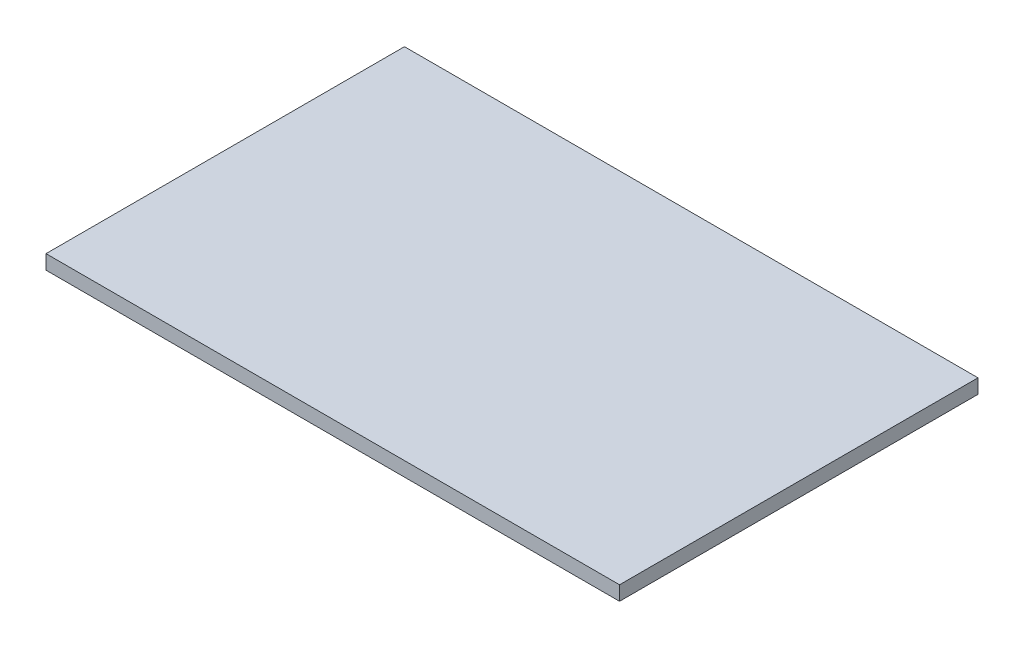
ISO-10303-21;
HEADER;
FILE_DESCRIPTION(('STEP AP214'),'2;1');
FILE_NAME('part.step','',(''),(''),'','','');
FILE_SCHEMA(('AUTOMOTIVE_DESIGN { 1 0 10303 214 1 1 1 1 }'));
ENDSEC;
DATA;
#1=APPLICATION_CONTEXT('core data for automotive mechanical design processes');
#2=APPLICATION_PROTOCOL_DEFINITION('international standard','automotive_design',2000,#1);
#3=PRODUCT_CONTEXT('',#1,'mechanical');
#4=PRODUCT('Part','Part','',(#3));
#5=PRODUCT_RELATED_PRODUCT_CATEGORY('part','',(#4));
#6=PRODUCT_DEFINITION_FORMATION('','',#4);
#7=PRODUCT_DEFINITION_CONTEXT('part definition',#1,'design');
#8=PRODUCT_DEFINITION('design','',#6,#7);
#9=PRODUCT_DEFINITION_SHAPE('','',#8);
#10=(LENGTH_UNIT() NAMED_UNIT(*) SI_UNIT(.MILLI.,.METRE.));
#11=(NAMED_UNIT(*) PLANE_ANGLE_UNIT() SI_UNIT($,.RADIAN.));
#12=(NAMED_UNIT(*) SI_UNIT($,.STERADIAN.) SOLID_ANGLE_UNIT());
#13=UNCERTAINTY_MEASURE_WITH_UNIT(LENGTH_MEASURE(1.E-05),#10,'distance_accuracy_value','');
#14=(GEOMETRIC_REPRESENTATION_CONTEXT(3) GLOBAL_UNCERTAINTY_ASSIGNED_CONTEXT((#13)) GLOBAL_UNIT_ASSIGNED_CONTEXT((#10,
#11,#12)) REPRESENTATION_CONTEXT('',''));
#15=CARTESIAN_POINT('',(0.,0.,0.));
#16=DIRECTION('',(0.,0.,1.));
#17=DIRECTION('',(1.,0.,0.));
#18=AXIS2_PLACEMENT_3D('',#15,#16,#17);
#19=CARTESIAN_POINT('',(-22.8254847645429,1.,-19.8891966759003));
#20=DIRECTION('',(1.,0.,0.));
#21=DIRECTION('',(0.,0.,-1.));
#22=AXIS2_PLACEMENT_3D('',#19,#20,#21);
#23=PLANE('',#22);
#24=DIRECTION('',(0.,0.,1.));
#25=VECTOR('',#24,1.);
#26=CARTESIAN_POINT('',(-22.8254847645429,0.,-19.8891966759003));
#27=LINE('',#26,#25);
#28=CARTESIAN_POINT('',(-22.8254847645429,0.,-19.8891966759003));
#29=VERTEX_POINT('',#28);
#30=CARTESIAN_POINT('',(-22.8254847645429,0.,5.11080332409972));
#31=VERTEX_POINT('',#30);
#32=EDGE_CURVE('E107',#29,#31,#27,.T.);
#33=ORIENTED_EDGE('',*,*,#32,.T.);
#34=DIRECTION('',(0.,-1.,0.));
#35=VECTOR('',#34,1.);
#36=CARTESIAN_POINT('',(-22.8254847645429,1.,5.11080332409972));
#37=LINE('',#36,#35);
#38=CARTESIAN_POINT('',(-22.8254847645429,1.,5.11080332409972));
#39=VERTEX_POINT('',#38);
#40=EDGE_CURVE('E11',#39,#31,#37,.T.);
#41=ORIENTED_EDGE('',*,*,#40,.F.);
#42=DIRECTION('',(0.,0.,1.));
#43=VECTOR('',#42,1.);
#44=CARTESIAN_POINT('',(-22.8254847645429,1.,-19.8891966759003));
#45=LINE('',#44,#43);
#46=CARTESIAN_POINT('',(-22.8254847645429,1.,-19.8891966759003));
#47=VERTEX_POINT('',#46);
#48=EDGE_CURVE('E91',#47,#39,#45,.T.);
#49=ORIENTED_EDGE('',*,*,#48,.F.);
#50=DIRECTION('',(0.,-1.,0.));
#51=VECTOR('',#50,1.);
#52=CARTESIAN_POINT('',(-22.8254847645429,1.,-19.8891966759003));
#53=LINE('',#52,#51);
#54=EDGE_CURVE('E103',#47,#29,#53,.T.);
#55=ORIENTED_EDGE('',*,*,#54,.T.);
#56=EDGE_LOOP('',(#33,#41,#49,#55));
#57=FACE_BOUND('',#56,.T.);
#58=ADVANCED_FACE('F39',(#57),#23,.F.);
#59=CARTESIAN_POINT('',(-22.8254847645429,1.,5.11080332409972));
#60=DIRECTION('',(0.,0.,-1.));
#61=DIRECTION('',(-1.,0.,0.));
#62=AXIS2_PLACEMENT_3D('',#59,#60,#61);
#63=PLANE('',#62);
#64=DIRECTION('',(1.,0.,0.));
#65=VECTOR('',#64,1.);
#66=CARTESIAN_POINT('',(-22.8254847645429,0.,5.11080332409972));
#67=LINE('',#66,#65);
#68=CARTESIAN_POINT('',(17.1745152354571,0.,5.11080332409972));
#69=VERTEX_POINT('',#68);
#70=EDGE_CURVE('E96',#31,#69,#67,.T.);
#71=ORIENTED_EDGE('',*,*,#70,.T.);
#72=DIRECTION('',(0.,-1.,0.));
#73=VECTOR('',#72,1.);
#74=CARTESIAN_POINT('',(17.1745152354571,1.,5.11080332409972));
#75=LINE('',#74,#73);
#76=CARTESIAN_POINT('',(17.1745152354571,1.,5.11080332409972));
#77=VERTEX_POINT('',#76);
#78=EDGE_CURVE('E48',#77,#69,#75,.T.);
#79=ORIENTED_EDGE('',*,*,#78,.F.);
#80=DIRECTION('',(1.,0.,0.));
#81=VECTOR('',#80,1.);
#82=CARTESIAN_POINT('',(-22.8254847645429,1.,5.11080332409972));
#83=LINE('',#82,#81);
#84=EDGE_CURVE('E86',#39,#77,#83,.T.);
#85=ORIENTED_EDGE('',*,*,#84,.F.);
#86=ORIENTED_EDGE('',*,*,#40,.T.);
#87=EDGE_LOOP('',(#71,#79,#85,#86));
#88=FACE_BOUND('',#87,.T.);
#89=ADVANCED_FACE('F95',(#88),#63,.F.);
#90=CARTESIAN_POINT('',(17.1745152354571,1.,-19.8891966759003));
#91=DIRECTION('',(-1.,0.,0.));
#92=DIRECTION('',(0.,0.,1.));
#93=AXIS2_PLACEMENT_3D('',#90,#91,#92);
#94=PLANE('',#93);
#95=DIRECTION('',(0.,0.,-1.));
#96=VECTOR('',#95,1.);
#97=CARTESIAN_POINT('',(17.1745152354571,0.,-19.8891966759003));
#98=LINE('',#97,#96);
#99=CARTESIAN_POINT('',(17.1745152354571,0.,-19.8891966759003));
#100=VERTEX_POINT('',#99);
#101=EDGE_CURVE('E73',#69,#100,#98,.T.);
#102=ORIENTED_EDGE('',*,*,#101,.T.);
#103=DIRECTION('',(0.,-1.,0.));
#104=VECTOR('',#103,1.);
#105=CARTESIAN_POINT('',(17.1745152354571,1.,-19.8891966759003));
#106=LINE('',#105,#104);
#107=CARTESIAN_POINT('',(17.1745152354571,1.,-19.8891966759003));
#108=VERTEX_POINT('',#107);
#109=EDGE_CURVE('E98',#108,#100,#106,.T.);
#110=ORIENTED_EDGE('',*,*,#109,.F.);
#111=DIRECTION('',(0.,0.,-1.));
#112=VECTOR('',#111,1.);
#113=CARTESIAN_POINT('',(17.1745152354571,1.,-19.8891966759003));
#114=LINE('',#113,#112);
#115=EDGE_CURVE('E89',#77,#108,#114,.T.);
#116=ORIENTED_EDGE('',*,*,#115,.F.);
#117=ORIENTED_EDGE('',*,*,#78,.T.);
#118=EDGE_LOOP('',(#102,#110,#116,#117));
#119=FACE_BOUND('',#118,.T.);
#120=ADVANCED_FACE('F99',(#119),#94,.F.);
#121=CARTESIAN_POINT('',(-22.8254847645429,1.,-19.8891966759003));
#122=DIRECTION('',(0.,0.,1.));
#123=DIRECTION('',(1.,0.,0.));
#124=AXIS2_PLACEMENT_3D('',#121,#122,#123);
#125=PLANE('',#124);
#126=DIRECTION('',(-1.,0.,0.));
#127=VECTOR('',#126,1.);
#128=CARTESIAN_POINT('',(-22.8254847645429,0.,-19.8891966759003));
#129=LINE('',#128,#127);
#130=EDGE_CURVE('E79',#100,#29,#129,.T.);
#131=ORIENTED_EDGE('',*,*,#130,.T.);
#132=ORIENTED_EDGE('',*,*,#54,.F.);
#133=DIRECTION('',(-1.,0.,0.));
#134=VECTOR('',#133,1.);
#135=CARTESIAN_POINT('',(-22.8254847645429,1.,-19.8891966759003));
#136=LINE('',#135,#134);
#137=EDGE_CURVE('E56',#108,#47,#136,.T.);
#138=ORIENTED_EDGE('',*,*,#137,.F.);
#139=ORIENTED_EDGE('',*,*,#109,.T.);
#140=EDGE_LOOP('',(#131,#132,#138,#139));
#141=FACE_BOUND('',#140,.T.);
#142=ADVANCED_FACE('F120',(#141),#125,.F.);
#143=CARTESIAN_POINT('',(0.,1.,0.));
#144=DIRECTION('',(0.,1.,0.));
#145=DIRECTION('',(0.,0.,1.));
#146=AXIS2_PLACEMENT_3D('',#143,#144,#145);
#147=PLANE('',#146);
#148=ORIENTED_EDGE('',*,*,#48,.T.);
#149=ORIENTED_EDGE('',*,*,#84,.T.);
#150=ORIENTED_EDGE('',*,*,#115,.T.);
#151=ORIENTED_EDGE('',*,*,#137,.T.);
#152=EDGE_LOOP('',(#148,#149,#150,#151));
#153=FACE_BOUND('',#152,.T.);
#154=ADVANCED_FACE('F87',(#153),#147,.T.);
#155=CARTESIAN_POINT('',(0.,0.,0.));
#156=DIRECTION('',(0.,1.,0.));
#157=DIRECTION('',(0.,0.,1.));
#158=AXIS2_PLACEMENT_3D('',#155,#156,#157);
#159=PLANE('',#158);
#160=ORIENTED_EDGE('',*,*,#32,.F.);
#161=ORIENTED_EDGE('',*,*,#130,.F.);
#162=ORIENTED_EDGE('',*,*,#101,.F.);
#163=ORIENTED_EDGE('',*,*,#70,.F.);
#164=EDGE_LOOP('',(#160,#161,#162,#163));
#165=FACE_BOUND('',#164,.T.);
#166=ADVANCED_FACE('F123',(#165),#159,.F.);
#167=CLOSED_SHELL('',(#58,#89,#120,#142,#154,#166));
#168=MANIFOLD_SOLID_BREP('B2',#167);
#169=ADVANCED_BREP_SHAPE_REPRESENTATION('',(#18,#168),#14);
#170=SHAPE_DEFINITION_REPRESENTATION(#9,#169);
ENDSEC;
END-ISO-10303-21;
